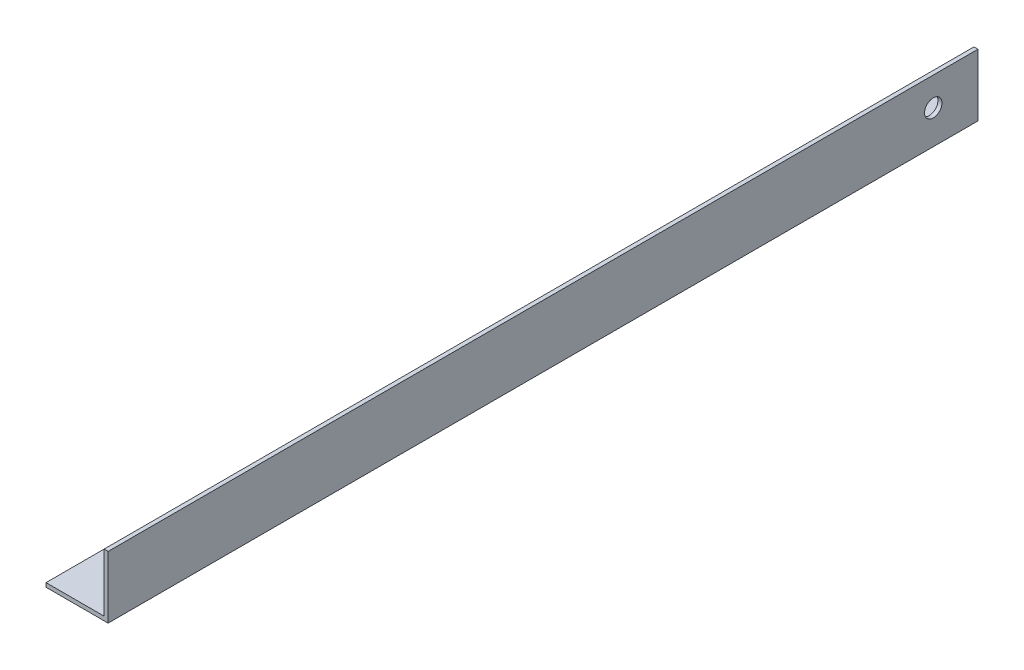
ISO-10303-21;
HEADER;
FILE_DESCRIPTION(('STEP AP214'),'2;1');
FILE_NAME('part.step','',(''),(''),'','','');
FILE_SCHEMA(('AUTOMOTIVE_DESIGN { 1 0 10303 214 1 1 1 1 }'));
ENDSEC;
DATA;
#1=APPLICATION_CONTEXT('core data for automotive mechanical design processes');
#2=APPLICATION_PROTOCOL_DEFINITION('international standard','automotive_design',2000,#1);
#3=PRODUCT_CONTEXT('',#1,'mechanical');
#4=PRODUCT('Part','Part','',(#3));
#5=PRODUCT_RELATED_PRODUCT_CATEGORY('part','',(#4));
#6=PRODUCT_DEFINITION_FORMATION('','',#4);
#7=PRODUCT_DEFINITION_CONTEXT('part definition',#1,'design');
#8=PRODUCT_DEFINITION('design','',#6,#7);
#9=PRODUCT_DEFINITION_SHAPE('','',#8);
#10=(LENGTH_UNIT() NAMED_UNIT(*) SI_UNIT(.MILLI.,.METRE.));
#11=(NAMED_UNIT(*) PLANE_ANGLE_UNIT() SI_UNIT($,.RADIAN.));
#12=(NAMED_UNIT(*) SI_UNIT($,.STERADIAN.) SOLID_ANGLE_UNIT());
#13=UNCERTAINTY_MEASURE_WITH_UNIT(LENGTH_MEASURE(1.E-05),#10,'distance_accuracy_value','');
#14=(GEOMETRIC_REPRESENTATION_CONTEXT(3) GLOBAL_UNCERTAINTY_ASSIGNED_CONTEXT((#13)) GLOBAL_UNIT_ASSIGNED_CONTEXT((#10,
#11,#12)) REPRESENTATION_CONTEXT('',''));
#15=CARTESIAN_POINT('',(0.,0.,0.));
#16=DIRECTION('',(0.,0.,1.));
#17=DIRECTION('',(1.,0.,0.));
#18=AXIS2_PLACEMENT_3D('',#15,#16,#17);
#19=CARTESIAN_POINT('',(-47.7895756819322,0.,355.6));
#20=DIRECTION('',(1.,0.,0.));
#21=DIRECTION('',(0.,0.,-1.));
#22=AXIS2_PLACEMENT_3D('',#19,#20,#21);
#23=PLANE('',#22);
#24=DIRECTION('',(0.,-1.,0.));
#25=VECTOR('',#24,1.);
#26=CARTESIAN_POINT('',(-47.7895756819322,0.,355.6));
#27=LINE('',#26,#25);
#28=CARTESIAN_POINT('',(-47.7895756819322,-23.749,355.6));
#29=VERTEX_POINT('',#28);
#30=CARTESIAN_POINT('',(-47.7895756819322,-25.4,355.6));
#31=VERTEX_POINT('',#30);
#32=EDGE_CURVE('E78',#29,#31,#27,.T.);
#33=ORIENTED_EDGE('',*,*,#32,.F.);
#34=DIRECTION('',(0.,0.,-1.));
#35=VECTOR('',#34,1.);
#36=CARTESIAN_POINT('',(-47.7895756819322,-23.749,355.6));
#37=LINE('',#36,#35);
#38=CARTESIAN_POINT('',(-47.7895756819322,-23.749,0.));
#39=VERTEX_POINT('',#38);
#40=EDGE_CURVE('E98',#29,#39,#37,.T.);
#41=ORIENTED_EDGE('',*,*,#40,.T.);
#42=DIRECTION('',(0.,-1.,0.));
#43=VECTOR('',#42,1.);
#44=CARTESIAN_POINT('',(-47.7895756819322,0.,0.));
#45=LINE('',#44,#43);
#46=CARTESIAN_POINT('',(-47.7895756819322,-25.4,0.));
#47=VERTEX_POINT('',#46);
#48=EDGE_CURVE('E117',#39,#47,#45,.T.);
#49=ORIENTED_EDGE('',*,*,#48,.T.);
#50=DIRECTION('',(0.,0.,-1.));
#51=VECTOR('',#50,1.);
#52=CARTESIAN_POINT('',(-47.7895756819322,-25.4,355.6));
#53=LINE('',#52,#51);
#54=EDGE_CURVE('E40',#31,#47,#53,.T.);
#55=ORIENTED_EDGE('',*,*,#54,.F.);
#56=EDGE_LOOP('',(#33,#41,#49,#55));
#57=FACE_BOUND('',#56,.T.);
#58=ADVANCED_FACE('F32',(#57),#23,.F.);
#59=CARTESIAN_POINT('',(-47.7895756819322,-25.4,355.6));
#60=DIRECTION('',(0.,1.,0.));
#61=DIRECTION('',(0.,0.,1.));
#62=AXIS2_PLACEMENT_3D('',#59,#60,#61);
#63=PLANE('',#62);
#64=DIRECTION('',(1.,0.,0.));
#65=VECTOR('',#64,1.);
#66=CARTESIAN_POINT('',(-47.7895756819322,-25.4,0.));
#67=LINE('',#66,#65);
#68=CARTESIAN_POINT('',(-22.3895756819322,-25.4,0.));
#69=VERTEX_POINT('',#68);
#70=EDGE_CURVE('E126',#47,#69,#67,.T.);
#71=ORIENTED_EDGE('',*,*,#70,.T.);
#72=DIRECTION('',(0.,0.,-1.));
#73=VECTOR('',#72,1.);
#74=CARTESIAN_POINT('',(-22.3895756819322,-25.4,355.6));
#75=LINE('',#74,#73);
#76=CARTESIAN_POINT('',(-22.3895756819322,-25.4,355.6));
#77=VERTEX_POINT('',#76);
#78=EDGE_CURVE('E132',#77,#69,#75,.T.);
#79=ORIENTED_EDGE('',*,*,#78,.F.);
#80=DIRECTION('',(1.,0.,0.));
#81=VECTOR('',#80,1.);
#82=CARTESIAN_POINT('',(-47.7895756819322,-25.4,355.6));
#83=LINE('',#82,#81);
#84=EDGE_CURVE('E119',#31,#77,#83,.T.);
#85=ORIENTED_EDGE('',*,*,#84,.F.);
#86=ORIENTED_EDGE('',*,*,#54,.T.);
#87=EDGE_LOOP('',(#71,#79,#85,#86));
#88=FACE_BOUND('',#87,.T.);
#89=ADVANCED_FACE('F137',(#88),#63,.F.);
#90=CARTESIAN_POINT('',(-22.3895756819322,0.,355.6));
#91=DIRECTION('',(-1.,0.,0.));
#92=DIRECTION('',(0.,-1.,0.));
#93=AXIS2_PLACEMENT_3D('',#90,#91,#92);
#94=PLANE('',#93);
#95=CARTESIAN_POINT('',(-22.3895756819322,-11.6485013030569,18.288));
#96=DIRECTION('',(1.,0.,0.));
#97=DIRECTION('',(0.,1.,0.));
#98=AXIS2_PLACEMENT_3D('',#95,#96,#97);
#99=CIRCLE('',#98,3.556);
#100=CARTESIAN_POINT('',(-22.3895756819322,-8.09250130305695,18.288));
#101=VERTEX_POINT('',#100);
#102=EDGE_CURVE('E110',#101,#101,#99,.T.);
#103=ORIENTED_EDGE('',*,*,#102,.F.);
#104=EDGE_LOOP('',(#103));
#105=FACE_BOUND('',#104,.T.);
#106=DIRECTION('',(0.,1.,0.));
#107=VECTOR('',#106,1.);
#108=CARTESIAN_POINT('',(-22.3895756819322,0.,0.));
#109=LINE('',#108,#107);
#110=CARTESIAN_POINT('',(-22.3895756819322,0.,0.));
#111=VERTEX_POINT('',#110);
#112=EDGE_CURVE('E73',#69,#111,#109,.T.);
#113=ORIENTED_EDGE('',*,*,#112,.T.);
#114=DIRECTION('',(0.,0.,-1.));
#115=VECTOR('',#114,1.);
#116=CARTESIAN_POINT('',(-22.3895756819322,0.,355.6));
#117=LINE('',#116,#115);
#118=CARTESIAN_POINT('',(-22.3895756819322,0.,355.6));
#119=VERTEX_POINT('',#118);
#120=EDGE_CURVE('E124',#119,#111,#117,.T.);
#121=ORIENTED_EDGE('',*,*,#120,.F.);
#122=DIRECTION('',(0.,1.,0.));
#123=VECTOR('',#122,1.);
#124=CARTESIAN_POINT('',(-22.3895756819322,0.,355.6));
#125=LINE('',#124,#123);
#126=EDGE_CURVE('E56',#77,#119,#125,.T.);
#127=ORIENTED_EDGE('',*,*,#126,.F.);
#128=ORIENTED_EDGE('',*,*,#78,.T.);
#129=EDGE_LOOP('',(#113,#121,#127,#128));
#130=FACE_BOUND('',#129,.T.);
#131=ADVANCED_FACE('F147',(#105,#130),#94,.F.);
#132=CARTESIAN_POINT('',(-47.7895756819322,0.,355.6));
#133=DIRECTION('',(0.,-1.,0.));
#134=DIRECTION('',(1.,0.,0.));
#135=AXIS2_PLACEMENT_3D('',#132,#133,#134);
#136=PLANE('',#135);
#137=DIRECTION('',(-1.,0.,0.));
#138=VECTOR('',#137,1.);
#139=CARTESIAN_POINT('',(-47.7895756819322,0.,0.));
#140=LINE('',#139,#138);
#141=CARTESIAN_POINT('',(-24.0405756819322,0.,0.));
#142=VERTEX_POINT('',#141);
#143=EDGE_CURVE('E120',#111,#142,#140,.T.);
#144=ORIENTED_EDGE('',*,*,#143,.T.);
#145=DIRECTION('',(0.,0.,1.));
#146=VECTOR('',#145,1.);
#147=CARTESIAN_POINT('',(-24.0405756819322,0.,355.6));
#148=LINE('',#147,#146);
#149=CARTESIAN_POINT('',(-24.0405756819322,0.,355.6));
#150=VERTEX_POINT('',#149);
#151=EDGE_CURVE('E115',#142,#150,#148,.T.);
#152=ORIENTED_EDGE('',*,*,#151,.T.);
#153=DIRECTION('',(-1.,0.,0.));
#154=VECTOR('',#153,1.);
#155=CARTESIAN_POINT('',(-47.7895756819322,0.,355.6));
#156=LINE('',#155,#154);
#157=EDGE_CURVE('E107',#119,#150,#156,.T.);
#158=ORIENTED_EDGE('',*,*,#157,.F.);
#159=ORIENTED_EDGE('',*,*,#120,.T.);
#160=EDGE_LOOP('',(#144,#152,#158,#159));
#161=FACE_BOUND('',#160,.T.);
#162=ADVANCED_FACE('F146',(#161),#136,.F.);
#163=CARTESIAN_POINT('',(0.,0.,355.6));
#164=DIRECTION('',(0.,0.,1.));
#165=DIRECTION('',(1.,0.,0.));
#166=AXIS2_PLACEMENT_3D('',#163,#164,#165);
#167=PLANE('',#166);
#168=DIRECTION('',(0.,1.,0.));
#169=VECTOR('',#168,1.);
#170=CARTESIAN_POINT('',(-24.0405756819322,2.729044322172,355.6));
#171=LINE('',#170,#169);
#172=CARTESIAN_POINT('',(-24.0405756819322,-23.749,355.6));
#173=VERTEX_POINT('',#172);
#174=EDGE_CURVE('E100',#173,#150,#171,.T.);
#175=ORIENTED_EDGE('',*,*,#174,.F.);
#176=DIRECTION('',(1.,0.,0.));
#177=VECTOR('',#176,1.);
#178=CARTESIAN_POINT('',(-50.2143853273278,-23.749,355.6));
#179=LINE('',#178,#177);
#180=EDGE_CURVE('E94',#29,#173,#179,.T.);
#181=ORIENTED_EDGE('',*,*,#180,.F.);
#182=ORIENTED_EDGE('',*,*,#32,.T.);
#183=ORIENTED_EDGE('',*,*,#84,.T.);
#184=ORIENTED_EDGE('',*,*,#126,.T.);
#185=ORIENTED_EDGE('',*,*,#157,.T.);
#186=EDGE_LOOP('',(#175,#181,#182,#183,#184,#185));
#187=FACE_BOUND('',#186,.T.);
#188=ADVANCED_FACE('F105',(#187),#167,.T.);
#189=CARTESIAN_POINT('',(0.,0.,0.));
#190=DIRECTION('',(0.,0.,1.));
#191=DIRECTION('',(1.,0.,0.));
#192=AXIS2_PLACEMENT_3D('',#189,#190,#191);
#193=PLANE('',#192);
#194=DIRECTION('',(1.,0.,0.));
#195=VECTOR('',#194,1.);
#196=CARTESIAN_POINT('',(0.,-23.749,0.));
#197=LINE('',#196,#195);
#198=CARTESIAN_POINT('',(-24.0405756819322,-23.749,0.));
#199=VERTEX_POINT('',#198);
#200=EDGE_CURVE('E11',#39,#199,#197,.T.);
#201=ORIENTED_EDGE('',*,*,#200,.T.);
#202=DIRECTION('',(0.,1.,0.));
#203=VECTOR('',#202,1.);
#204=CARTESIAN_POINT('',(-24.0405756819322,2.729044322172,0.));
#205=LINE('',#204,#203);
#206=EDGE_CURVE('E47',#199,#142,#205,.T.);
#207=ORIENTED_EDGE('',*,*,#206,.T.);
#208=ORIENTED_EDGE('',*,*,#143,.F.);
#209=ORIENTED_EDGE('',*,*,#112,.F.);
#210=ORIENTED_EDGE('',*,*,#70,.F.);
#211=ORIENTED_EDGE('',*,*,#48,.F.);
#212=EDGE_LOOP('',(#201,#207,#208,#209,#210,#211));
#213=FACE_BOUND('',#212,.T.);
#214=ADVANCED_FACE('F143',(#213),#193,.F.);
#215=CARTESIAN_POINT('',(-24.0405756819322,2.729044322172,0.));
#216=DIRECTION('',(1.,0.,0.));
#217=DIRECTION('',(0.,1.,0.));
#218=AXIS2_PLACEMENT_3D('',#215,#216,#217);
#219=PLANE('',#218);
#220=CARTESIAN_POINT('',(-24.0405756819322,-11.6485013030569,18.288));
#221=DIRECTION('',(1.,0.,0.));
#222=DIRECTION('',(0.,1.,0.));
#223=AXIS2_PLACEMENT_3D('',#220,#221,#222);
#224=CIRCLE('',#223,3.556);
#225=CARTESIAN_POINT('',(-24.0405756819322,-8.09250130305695,18.288));
#226=VERTEX_POINT('',#225);
#227=EDGE_CURVE('E35',#226,#226,#224,.T.);
#228=ORIENTED_EDGE('',*,*,#227,.T.);
#229=EDGE_LOOP('',(#228));
#230=FACE_BOUND('',#229,.T.);
#231=ORIENTED_EDGE('',*,*,#206,.F.);
#232=DIRECTION('',(0.,0.,1.));
#233=VECTOR('',#232,1.);
#234=CARTESIAN_POINT('',(-24.0405756819322,-23.749,0.));
#235=LINE('',#234,#233);
#236=EDGE_CURVE('E96',#199,#173,#235,.T.);
#237=ORIENTED_EDGE('',*,*,#236,.T.);
#238=ORIENTED_EDGE('',*,*,#174,.T.);
#239=ORIENTED_EDGE('',*,*,#151,.F.);
#240=EDGE_LOOP('',(#231,#237,#238,#239));
#241=FACE_BOUND('',#240,.T.);
#242=ADVANCED_FACE('F102',(#230,#241),#219,.F.);
#243=CARTESIAN_POINT('',(-50.2143853273278,-23.749,0.));
#244=DIRECTION('',(0.,-1.,0.));
#245=DIRECTION('',(0.,0.,-1.));
#246=AXIS2_PLACEMENT_3D('',#243,#244,#245);
#247=PLANE('',#246);
#248=ORIENTED_EDGE('',*,*,#180,.T.);
#249=ORIENTED_EDGE('',*,*,#236,.F.);
#250=ORIENTED_EDGE('',*,*,#200,.F.);
#251=ORIENTED_EDGE('',*,*,#40,.F.);
#252=EDGE_LOOP('',(#248,#249,#250,#251));
#253=FACE_BOUND('',#252,.T.);
#254=ADVANCED_FACE('F95',(#253),#247,.F.);
#255=CARTESIAN_POINT('',(-47.7895756819322,-11.648501303057,18.288));
#256=DIRECTION('',(1.,0.,0.));
#257=DIRECTION('',(0.,1.,0.));
#258=AXIS2_PLACEMENT_3D('',#255,#256,#257);
#259=CYLINDRICAL_SURFACE('',#258,3.556);
#260=ORIENTED_EDGE('',*,*,#102,.T.);
#261=EDGE_LOOP('',(#260));
#262=FACE_BOUND('',#261,.T.);
#263=ORIENTED_EDGE('',*,*,#227,.F.);
#264=EDGE_LOOP('',(#263));
#265=FACE_BOUND('',#264,.T.);
#266=ADVANCED_FACE('F208',(#262,#265),#259,.F.);
#267=CLOSED_SHELL('',(#58,#89,#131,#162,#188,#214,#242,#254,#266));
#268=MANIFOLD_SOLID_BREP('B2',#267);
#269=ADVANCED_BREP_SHAPE_REPRESENTATION('',(#18,#268),#14);
#270=SHAPE_DEFINITION_REPRESENTATION(#9,#269);
ENDSEC;
END-ISO-10303-21;
